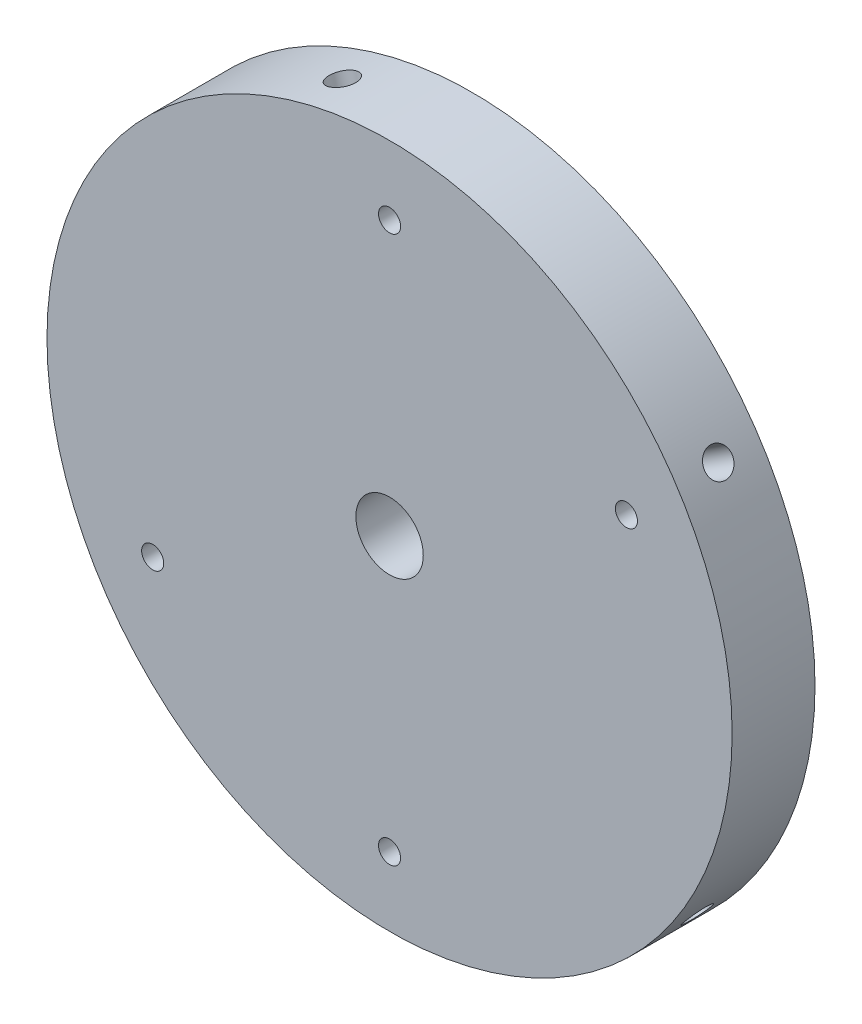
ISO-10303-21;
HEADER;
FILE_DESCRIPTION(('STEP AP214'),'2;1');
FILE_NAME('part.step','',(''),(''),'','','');
FILE_SCHEMA(('AUTOMOTIVE_DESIGN { 1 0 10303 214 1 1 1 1 }'));
ENDSEC;
DATA;
#1=APPLICATION_CONTEXT('core data for automotive mechanical design processes');
#2=APPLICATION_PROTOCOL_DEFINITION('international standard','automotive_design',2000,#1);
#3=PRODUCT_CONTEXT('',#1,'mechanical');
#4=PRODUCT('Part','Part','',(#3));
#5=PRODUCT_RELATED_PRODUCT_CATEGORY('part','',(#4));
#6=PRODUCT_DEFINITION_FORMATION('','',#4);
#7=PRODUCT_DEFINITION_CONTEXT('part definition',#1,'design');
#8=PRODUCT_DEFINITION('design','',#6,#7);
#9=PRODUCT_DEFINITION_SHAPE('','',#8);
#10=(LENGTH_UNIT() NAMED_UNIT(*) SI_UNIT(.MILLI.,.METRE.));
#11=(NAMED_UNIT(*) PLANE_ANGLE_UNIT() SI_UNIT($,.RADIAN.));
#12=(NAMED_UNIT(*) SI_UNIT($,.STERADIAN.) SOLID_ANGLE_UNIT());
#13=UNCERTAINTY_MEASURE_WITH_UNIT(LENGTH_MEASURE(1.E-05),#10,'distance_accuracy_value','');
#14=(GEOMETRIC_REPRESENTATION_CONTEXT(3) GLOBAL_UNCERTAINTY_ASSIGNED_CONTEXT((#13)) GLOBAL_UNIT_ASSIGNED_CONTEXT((#10,
#11,#12)) REPRESENTATION_CONTEXT('',''));
#15=CARTESIAN_POINT('',(0.,0.,0.));
#16=DIRECTION('',(0.,0.,1.));
#17=DIRECTION('',(1.,0.,0.));
#18=AXIS2_PLACEMENT_3D('',#15,#16,#17);
#19=CARTESIAN_POINT('',(0.,0.,15.));
#20=DIRECTION('',(0.,0.,-1.));
#21=DIRECTION('',(-1.,0.,0.));
#22=AXIS2_PLACEMENT_3D('',#19,#20,#21);
#23=CYLINDRICAL_SURFACE('',#22,62.);
#24=CARTESIAN_POINT('',(0.,0.,15.));
#25=DIRECTION('',(0.,0.,1.));
#26=DIRECTION('',(1.,0.,0.));
#27=AXIS2_PLACEMENT_3D('',#24,#25,#26);
#28=CIRCLE('',#27,62.);
#29=CARTESIAN_POINT('',(62.,0.,15.));
#30=VERTEX_POINT('',#29);
#31=EDGE_CURVE('E113',#30,#30,#28,.T.);
#32=ORIENTED_EDGE('',*,*,#31,.F.);
#33=EDGE_LOOP('',(#32));
#34=FACE_BOUND('',#33,.T.);
#35=CARTESIAN_POINT('',(0.,0.,0.));
#36=DIRECTION('',(0.,0.,1.));
#37=DIRECTION('',(1.,0.,0.));
#38=AXIS2_PLACEMENT_3D('',#35,#36,#37);
#39=CIRCLE('',#38,62.);
#40=CARTESIAN_POINT('',(62.,0.,0.));
#41=VERTEX_POINT('',#40);
#42=EDGE_CURVE('E114',#41,#41,#39,.T.);
#43=ORIENTED_EDGE('',*,*,#42,.T.);
#44=EDGE_LOOP('',(#43));
#45=FACE_BOUND('',#44,.T.);
#46=CARTESIAN_POINT('',(50.5936887265813,35.8368338590032,7.5));
#47=CARTESIAN_POINT('',(50.5936926758918,35.8368290243256,7.64036484046));
#48=CARTESIAN_POINT('',(50.6005531169775,35.827148948982,7.78083000574222));
#49=CARTESIAN_POINT('',(50.6277909683293,35.7886478690633,8.05788764991403));
#50=CARTESIAN_POINT('',(50.6481844250087,35.7598041416484,8.19447533045048));
#51=CARTESIAN_POINT('',(50.701805445736,35.6837368764997,8.4597243103181));
#52=CARTESIAN_POINT('',(50.7350266114433,35.6365225017822,8.58838952426281));
#53=CARTESIAN_POINT('',(50.8131988457426,35.5249692371488,8.83417390736984));
#54=CARTESIAN_POINT('',(50.8581470938532,35.4606344647867,8.95129584348748));
#55=CARTESIAN_POINT('',(50.9583458604191,35.3164929314793,9.17078749612255));
#56=CARTESIAN_POINT('',(51.0136026736542,35.2366767158206,9.27314813078338));
#57=CARTESIAN_POINT('',(51.1326341849553,35.063723678787,9.46013447703892));
#58=CARTESIAN_POINT('',(51.1964092258855,34.9705863212167,9.54475947441003));
#59=CARTESIAN_POINT('',(51.3304956159422,34.7734728060118,9.69389350495605));
#60=CARTESIAN_POINT('',(51.4008090651043,34.6694931646933,9.75839604593983));
#61=CARTESIAN_POINT('',(51.5457942902115,34.4535627400288,9.86541233223202));
#62=CARTESIAN_POINT('',(51.62046604165,34.3416120015032,9.90792620116873));
#63=CARTESIAN_POINT('',(51.7718880772033,34.1129065475194,9.96973593763066));
#64=CARTESIAN_POINT('',(51.8486371980193,33.9961545024526,9.98904453557293));
#65=CARTESIAN_POINT('',(52.0020170987377,33.7610709582728,10.0039348911709));
#66=CARTESIAN_POINT('',(52.0786478793181,33.642739468247,9.99951678527569));
#67=CARTESIAN_POINT('',(52.2295819501551,33.407936813515,9.9670897791515));
#68=CARTESIAN_POINT('',(52.3038865675879,33.2914646073097,9.93909459480292));
#69=CARTESIAN_POINT('',(52.4481862466918,33.0636651198958,9.86032935522111));
#70=CARTESIAN_POINT('',(52.5181812949693,32.9523378546772,9.80955922920987));
#71=CARTESIAN_POINT('',(52.6520346750383,32.7380394682945,9.68666958744872));
#72=CARTESIAN_POINT('',(52.7158911974024,32.6350708123452,9.614543802187));
#73=CARTESIAN_POINT('',(52.8358152200186,32.4405565175598,9.45099483658834));
#74=CARTESIAN_POINT('',(52.8918826855811,32.349010929598,9.35957157031199));
#75=CARTESIAN_POINT('',(52.9948791220211,32.1800032728446,9.15994522513069));
#76=CARTESIAN_POINT('',(53.0418015590899,32.102551276042,9.05173024755381));
#77=CARTESIAN_POINT('',(53.1253276057696,31.9641380789722,8.82163419086395));
#78=CARTESIAN_POINT('',(53.1619312132752,31.9031768820694,8.69975310896283));
#79=CARTESIAN_POINT('',(53.2239571984162,31.7995918713834,8.44577761632251));
#80=CARTESIAN_POINT('',(53.2493793585697,31.7569684142738,8.31368300698656));
#81=CARTESIAN_POINT('',(53.2884509261385,31.6913626769,8.04303329383485));
#82=CARTESIAN_POINT('',(53.3021003912107,31.6683803004435,7.90447822166275));
#83=CARTESIAN_POINT('',(53.3173073744889,31.6427710686842,7.62494516386062));
#84=CARTESIAN_POINT('',(53.3188734014721,31.6401298897522,7.48396895324145));
#85=CARTESIAN_POINT('',(53.3099000946662,31.655246424322,7.2035035904594));
#86=CARTESIAN_POINT('',(53.2993607866879,31.6730040943299,7.06401443512651));
#87=CARTESIAN_POINT('',(53.2664241047385,31.7283641123697,6.79052935674922));
#88=CARTESIAN_POINT('',(53.2440306267215,31.7659599404425,6.65653164448464));
#89=CARTESIAN_POINT('',(53.1879053439236,31.859844616874,6.39777813070532));
#90=CARTESIAN_POINT('',(53.1541734968503,31.9161335349584,6.2730223636654));
#91=CARTESIAN_POINT('',(53.0761396031092,32.0457346261736,6.03621745685201));
#92=CARTESIAN_POINT('',(53.031831647427,32.1190563151272,5.92417547225561));
#93=CARTESIAN_POINT('',(52.9337153306703,32.2805000004911,5.71605050866476));
#94=CARTESIAN_POINT('',(52.8799069288246,32.3686220604173,5.61996759816223));
#95=CARTESIAN_POINT('',(52.7640770920216,32.5570942635511,5.44643248443826));
#96=CARTESIAN_POINT('',(52.7020509533899,32.65745140724,5.36899102327457));
#97=CARTESIAN_POINT('',(52.5713814396478,32.8673868771493,5.23501050699953));
#98=CARTESIAN_POINT('',(52.5027380857774,32.9769651737713,5.17847138479849));
#99=CARTESIAN_POINT('',(52.3606547398298,33.2021013436181,5.08791931374445));
#100=CARTESIAN_POINT('',(52.2872162286579,33.3176573684513,5.05389944600376));
#101=CARTESIAN_POINT('',(52.1375147665491,33.5514353170301,5.00932891130332));
#102=CARTESIAN_POINT('',(52.0612518241912,33.6696572326782,4.99877817306516));
#103=CARTESIAN_POINT('',(51.9080942458762,33.905301722333,5.00144617427888));
#104=CARTESIAN_POINT('',(51.8312000971995,34.0227248045613,5.01464803200868));
#105=CARTESIAN_POINT('',(51.678947345729,34.2535476211072,5.06441165533015));
#106=CARTESIAN_POINT('',(51.6035887459179,34.36694734761,5.10097346629227));
#107=CARTESIAN_POINT('',(51.4566453722543,34.5865742702737,5.19641607732657));
#108=CARTESIAN_POINT('',(51.3850606489642,34.692801370341,5.2552971763463));
#109=CARTESIAN_POINT('',(51.2478497787219,34.895169552454,5.39370313415374));
#110=CARTESIAN_POINT('',(51.1822234312019,34.9913109740158,5.47322729771691));
#111=CARTESIAN_POINT('',(51.0589347087521,35.17096936402,5.65071921469352));
#112=CARTESIAN_POINT('',(51.0012771615049,35.2544786825123,5.74869806419981));
#113=CARTESIAN_POINT('',(50.8957958765551,35.4065891433488,5.96032340024576));
#114=CARTESIAN_POINT('',(50.8479745702227,35.4751865999437,6.07397374897453));
#115=CARTESIAN_POINT('',(50.763702552755,35.5956729156681,6.31378069352726));
#116=CARTESIAN_POINT('',(50.7272608377677,35.6475485563886,6.43994708062256));
#117=CARTESIAN_POINT('',(50.6670336225876,35.7331004388864,6.70103906227634));
#118=CARTESIAN_POINT('',(50.6432330953463,35.7667982900248,6.83595404191434));
#119=CARTESIAN_POINT('',(50.6153590312695,35.8062250557015,7.05976248379998));
#120=CARTESIAN_POINT('',(50.6072444294056,35.8176897726741,7.14720458830734));
#121=CARTESIAN_POINT('',(50.5964080338224,35.8329956959987,7.3230845082356));
#122=CARTESIAN_POINT('',(50.5936862371701,35.8368369064973,7.41152232311489));
#123=CARTESIAN_POINT('',(50.5936887265813,35.8368338590032,7.5));
#124=B_SPLINE_CURVE_WITH_KNOTS('',3,(#46,#47,#48,#49,#50,#51,#52,#53,#54,#55,#56,#57,#58,#59,
#60,#61,#62,#63,#64,#65,#66,#67,#68,#69,#70,#71,#72,#73,#74,#75,#76,#77,#78,#79,#80,#81,#82,#83,
#84,#85,#86,#87,#88,#89,#90,#91,#92,#93,#94,#95,#96,#97,#98,#99,#100,#101,#102,#103,#104,#105,
#106,#107,#108,#109,#110,#111,#112,#113,#114,#115,#116,#117,#118,#119,#120,#121,#122,#123),
.UNSPECIFIED.,.T.,.F.,(4,2,2,2,2,2,2,2,2,2,2,2,2,2,2,2,2,2,2,2,2,2,2,2,2,2,2,2,2,2,2,2,2,2,2,2,
2,2,4),(0.,0.420771556219567,0.842042924732916,1.26310443791832,1.68406477477344,
2.1052830115298,2.52651820771199,2.94788916852539,3.36925776021234,3.79039508331678,
4.21152998452125,4.63242006111271,5.05331144571949,5.47432651671281,5.89534346269418,
6.31666011690317,6.73797685706884,7.15930179158201,7.5806246626422,8.0016508242873,
8.4226760882315,8.84356306517681,9.26445161205908,9.68557586774526,10.1067019307334,
10.5280700880347,10.9494368928702,11.3706741754579,11.7919101786982,12.2128469144296,
12.6337844677202,13.0547276593044,13.4756566760519,13.8968395938404,14.318126496899,
14.7397456105034,15.1608624017037,15.4260919985229,15.6913214510812),.UNSPECIFIED.);
#125=CARTESIAN_POINT('',(50.5936887265813,35.8368338590032,7.5));
#126=VERTEX_POINT('',#125);
#127=EDGE_CURVE('E106',#126,#126,#124,.T.);
#128=ORIENTED_EDGE('',*,*,#127,.F.);
#129=EDGE_LOOP('',(#128));
#130=FACE_BOUND('',#129,.T.);
#131=CARTESIAN_POINT('',(49.717163989622,-37.0432666597998,7.5));
#132=CARTESIAN_POINT('',(49.7171606119745,-37.0432719098148,7.64036484046));
#133=CARTESIAN_POINT('',(49.7100743061251,-37.052787884802,7.78083000574222));
#134=CARTESIAN_POINT('',(49.681874562142,-37.0905901088166,8.05788764991403));
#135=CARTESIAN_POINT('',(49.6607444719177,-37.1188986406336,8.19447533045048));
#136=CARTESIAN_POINT('',(49.6049700103818,-37.1934013394534,8.4597243103181));
#137=CARTESIAN_POINT('',(49.5703323764204,-37.2395865897447,8.58838952426281));
#138=CARTESIAN_POINT('',(49.4883954660636,-37.3484046571181,8.83417390736984));
#139=CARTESIAN_POINT('',(49.4410992341178,-37.4110335193689,8.95129584348747));
#140=CARTESIAN_POINT('',(49.3349756112813,-37.5508703926234,9.17078749612255));
#141=CARTESIAN_POINT('',(49.2761411736177,-37.6280873119856,9.27314813078338));
#142=CARTESIAN_POINT('',(49.1484358205921,-37.794738434125,9.46013447703892));
#143=CARTESIAN_POINT('',(49.0795645012287,-37.8841731286791,9.54475947441004));
#144=CARTESIAN_POINT('',(48.9335333813851,-38.0726082897084,9.69389350495605));
#145=CARTESIAN_POINT('',(48.8563709166713,-38.1716118299536,9.75839604593983));
#146=CARTESIAN_POINT('',(48.6958117777192,-38.3762271438822,9.86541233223201));
#147=CARTESIAN_POINT('',(48.6124151385347,-38.4818388804082,9.90792620116873));
#148=CARTESIAN_POINT('',(48.4416953085199,-38.6965236660191,9.96973593763066));
#149=CARTESIAN_POINT('',(48.3543742979038,-38.8055947835448,9.98904453557293));
#150=CARTESIAN_POINT('',(48.1781935572554,-39.0241125478412,10.0039348911709));
#151=CARTESIAN_POINT('',(48.089333836075,-39.1335591924486,9.99951678527569));
#152=CARTESIAN_POINT('',(47.9126644341675,-39.3496640346856,9.9670897791515));
#153=CARTESIAN_POINT('',(47.824854173036,-39.4563238163757,9.93909459480291));
#154=CARTESIAN_POINT('',(47.6527950392483,-39.6639548794076,9.86032935522111));
#155=CARTESIAN_POINT('',(47.5685461776607,-39.7649261430701,9.80955922920987));
#156=CARTESIAN_POINT('',(47.4060992700557,-39.9584501156723,9.68666958744872));
#157=CARTESIAN_POINT('',(47.3279030094532,-40.0510003419509,9.614543802187));
#158=CARTESIAN_POINT('',(47.1799674829072,-40.2251630878579,9.45099483658833));
#159=CARTESIAN_POINT('',(47.1102282546284,-40.3067755587735,9.35957157031198));
#160=CARTESIAN_POINT('',(46.9813200705893,-40.4569572289212,9.15994522513068));
#161=CARTESIAN_POINT('',(46.9221586748018,-40.5255171017163,9.0517302475538));
#162=CARTESIAN_POINT('',(46.8163308696843,-40.6477271228317,8.82163419086395));
#163=CARTESIAN_POINT('',(46.7696644629035,-40.7013772681102,8.69975310896283));
#164=CARTESIAN_POINT('',(46.6903163470014,-40.7923770141226,8.44577761632251));
#165=CARTESIAN_POINT('',(46.6576349098915,-40.8297262978008,8.31368300698656));
#166=CARTESIAN_POINT('',(46.6073139242315,-40.887158854516,8.04303329383485));
#167=CARTESIAN_POINT('',(46.589674302014,-40.907242212113,7.90447822166275));
#168=CARTESIAN_POINT('',(46.5700176915381,-40.9296186004795,7.62494516386062));
#169=CARTESIAN_POINT('',(46.5679897100556,-40.9319241498217,7.48396895324145));
#170=CARTESIAN_POINT('',(46.5795934844633,-40.9187187618331,7.2035035904594));
#171=CARTESIAN_POINT('',(46.5932252069642,-40.9032078624902,7.06401443512651));
#172=CARTESIAN_POINT('',(46.6356977184025,-40.8547760301139,6.79052935674922));
#173=CARTESIAN_POINT('',(46.6645335104062,-40.8218608171311,6.65653164448464));
#174=CARTESIAN_POINT('',(46.736479477508,-40.7394705406686,6.39777813070532));
#175=CARTESIAN_POINT('',(46.7795897058501,-40.6899954154199,6.2730223636654));
#176=CARTESIAN_POINT('',(46.8787338688661,-40.5757318326103,6.03621745685201));
#177=CARTESIAN_POINT('',(46.9347750276393,-40.5109348146922,5.92417547225561));
#178=CARTESIAN_POINT('',(47.057997487316,-40.3677318098739,5.71605050866476));
#179=CARTESIAN_POINT('',(47.1251788360277,-40.2893257645705,5.61996759816223));
#180=CARTESIAN_POINT('',(47.2686331649308,-40.120923929762,5.44643248443826));
#181=CARTESIAN_POINT('',(47.3449113494603,-40.0309215035289,5.36899102327457));
#182=CARTESIAN_POINT('',(47.504192745726,-39.8417737830794,5.23501050699953));
#183=CARTESIAN_POINT('',(47.587195935876,-39.7426285182097,5.17847138479849));
#184=CARTESIAN_POINT('',(47.7574069887471,-39.5379283236581,5.08791931374445));
#185=CARTESIAN_POINT('',(47.8446135511681,-39.4323753735851,5.05389944600376));
#186=CARTESIAN_POINT('',(48.0206892966558,-39.2177594635267,5.00932891130332));
#187=CARTESIAN_POINT('',(48.1095584746721,-39.1086965142026,4.99877817306516));
#188=CARTESIAN_POINT('',(48.2863414075707,-38.890216849392,5.00144617427888));
#189=CARTESIAN_POINT('',(48.3742557963783,-38.7808004402875,5.01464803200868));
#190=CARTESIAN_POINT('',(48.5467326525191,-38.5646712958754,5.06441165533016));
#191=CARTESIAN_POINT('',(48.6312951133417,-38.4579585658194,5.10097346629227));
#192=CARTESIAN_POINT('',(48.7947647296221,-38.2503386612449,5.19641607732657));
#193=CARTESIAN_POINT('',(48.873671809314,-38.1494315645087,5.2552971763463));
#194=CARTESIAN_POINT('',(49.0237348968856,-37.9564010648645,5.39370313415374));
#195=CARTESIAN_POINT('',(49.0948911656853,-37.864277366289,5.47322729771691));
#196=CARTESIAN_POINT('',(49.2276581377541,-37.6915053277241,5.65071921469352));
#197=CARTESIAN_POINT('',(49.2892630573243,-37.6108639430982,5.74869806419981));
#198=CARTESIAN_POINT('',(49.4013331926615,-37.4635405622789,5.96032340024576));
#199=CARTESIAN_POINT('',(49.4517956544073,-37.396862017415,6.07397374897453));
#200=CARTESIAN_POINT('',(49.5403434645537,-37.2794822469126,6.31378069352726));
#201=CARTESIAN_POINT('',(49.5784190214626,-37.2287936618322,6.43994708062256));
#202=CARTESIAN_POINT('',(49.641172463779,-37.1450771907842,6.70103906227634));
#203=CARTESIAN_POINT('',(49.6658662572967,-37.1120283355844,6.83595404191433));
#204=CARTESIAN_POINT('',(49.6947497802079,-37.0733349846812,7.05976248379998));
#205=CARTESIAN_POINT('',(49.7031458241136,-37.0620747473212,7.14720458830734));
#206=CARTESIAN_POINT('',(49.7143539918365,-37.0470389322668,7.3230845082356));
#207=CARTESIAN_POINT('',(49.7171661186908,-37.0432633505015,7.41152232311489));
#208=CARTESIAN_POINT('',(49.717163989622,-37.0432666597998,7.5));
#209=B_SPLINE_CURVE_WITH_KNOTS('',3,(#131,#132,#133,#134,#135,#136,#137,#138,#139,#140,#141,
#142,#143,#144,#145,#146,#147,#148,#149,#150,#151,#152,#153,#154,#155,#156,#157,#158,#159,#160,
#161,#162,#163,#164,#165,#166,#167,#168,#169,#170,#171,#172,#173,#174,#175,#176,#177,#178,#179,
#180,#181,#182,#183,#184,#185,#186,#187,#188,#189,#190,#191,#192,#193,#194,#195,#196,#197,#198,
#199,#200,#201,#202,#203,#204,#205,#206,#207,#208),.UNSPECIFIED.,.T.,.F.,(4,2,2,2,2,2,2,2,2,2,2,
2,2,2,2,2,2,2,2,2,2,2,2,2,2,2,2,2,2,2,2,2,2,2,2,2,2,2,4),(0.,0.420771556219569,
0.842042924732916,1.26310443791832,1.68406477477344,2.1052830115298,2.526518207712,
2.94788916852539,3.36925776021233,3.79039508331677,4.21152998452126,4.63242006111271,
5.05331144571949,5.47432651671282,5.89534346269419,6.31666011690318,6.73797685706884,
7.15930179158201,7.5806246626422,8.0016508242873,8.4226760882315,8.84356306517681,
9.26445161205908,9.68557586774526,10.1067019307334,10.5280700880347,10.9494368928702,
11.3706741754579,11.7919101786982,12.2128469144296,12.6337844677202,13.0547276593044,
13.4756566760519,13.8968395938404,14.318126496899,14.7397456105034,15.1608624017037,
15.4260919985229,15.6913214510812),.UNSPECIFIED.);
#210=CARTESIAN_POINT('',(49.717163989622,-37.0432666597998,7.5));
#211=VERTEX_POINT('',#210);
#212=EDGE_CURVE('E63',#211,#211,#209,.T.);
#213=ORIENTED_EDGE('',*,*,#212,.F.);
#214=EDGE_LOOP('',(#213));
#215=FACE_BOUND('',#214,.T.);
#216=CARTESIAN_POINT('',(-19.8667915567424,-58.7308317090857,7.5));
#217=CARTESIAN_POINT('',(-19.8667975935538,-58.7308301190959,7.64036484046));
#218=CARTESIAN_POINT('',(-19.8780376125091,-58.7270312397305,7.78083000574222));
#219=CARTESIAN_POINT('',(-19.9227038641165,-58.7118932191031,8.05788764991403));
#220=CARTESIAN_POINT('',(-19.9561564347398,-58.7005451265228,8.19447533045048));
#221=CARTESIAN_POINT('',(-20.0442479684006,-58.6705230614983,8.4597243103181));
#222=CARTESIAN_POINT('',(-20.0988763691858,-58.6518527412397,8.58838952426281));
#223=CARTESIAN_POINT('',(-20.2276883990189,-58.6075527408332,8.83417390736984));
#224=CARTESIAN_POINT('',(-20.3018673260117,-58.5819247340188,8.95129584348748));
#225=CARTESIAN_POINT('',(-20.4676540984999,-58.5242071412632,9.17078749612255));
#226=CARTESIAN_POINT('',(-20.5592725939201,-58.4921136062769,9.27314813078338));
#227=CARTESIAN_POINT('',(-20.7572303539363,-58.4221566269888,9.46013447703892));
#228=CARTESIAN_POINT('',(-20.8635702110831,-58.3842929504264,9.54475947441003));
#229=CARTESIAN_POINT('',(-21.0879087966184,-58.3036387694131,9.69389350495605));
#230=CARTESIAN_POINT('',(-21.2059112716293,-58.2608466809727,9.75839604593983));
#231=CARTESIAN_POINT('',(-21.4501275018133,-58.1713754749348,9.86541233223202));
#232=CARTESIAN_POINT('',(-21.5763412108154,-58.1246963791933,9.90792620116873));
#233=CARTESIAN_POINT('',(-21.8332739038714,-58.0286734195844,9.96973593763066));
#234=CARTESIAN_POINT('',(-21.9639903771802,-57.9793310323394,9.98904453557293));
#235=CARTESIAN_POINT('',(-22.2262559637824,-57.8792988936405,10.0039348911709));
#236=CARTESIAN_POINT('',(-22.3578050722832,-57.8286091499367,9.99951678527569));
#237=CARTESIAN_POINT('',(-22.617926838271,-57.7273666328405,9.9670897791515));
#238=CARTESIAN_POINT('',(-22.7465011816441,-57.6768137969524,9.93909459480292));
#239=CARTESIAN_POINT('',(-22.9971392535038,-57.5773373636124,9.86032935522111));
#240=CARTESIAN_POINT('',(-23.1192029617559,-57.5284137712243,9.80955922920987));
#241=CARTESIAN_POINT('',(-23.3534540520921,-57.4337197775476,9.68666958744872));
#242=CARTESIAN_POINT('',(-23.4656385213017,-57.387950307105,9.614543802187));
#243=CARTESIAN_POINT('',(-23.6769917274669,-57.3010745088642,9.45099483658834));
#244=CARTESIAN_POINT('',(-23.7761604064549,-57.2599682018341,9.35957157031198));
#245=CARTESIAN_POINT('',(-23.9588264820591,-57.1837779217192,9.15994522513069));
#246=CARTESIAN_POINT('',(-24.0423126725464,-57.1486982565683,9.05173024755381));
#247=CARTESIAN_POINT('',(-24.1912438997436,-57.0858150063137,8.82163419086395));
#248=CARTESIAN_POINT('',(-24.2566889327726,-57.0580114226944,8.69975310896283));
#249=CARTESIAN_POINT('',(-24.3677547504842,-57.0106673480116,8.44577761632252));
#250=CARTESIAN_POINT('',(-24.4133751495729,-56.9911270176706,8.31368300698656));
#251=CARTESIAN_POINT('',(-24.483546796627,-56.9610165524077,8.04303329383485));
#252=CARTESIAN_POINT('',(-24.5080981477783,-56.9504463735543,7.90447822166275));
#253=CARTESIAN_POINT('',(-24.5354535844342,-56.9386665103509,7.62494516386062));
#254=CARTESIAN_POINT('',(-24.5382729729022,-56.9374502392752,7.48396895324145));
#255=CARTESIAN_POINT('',(-24.5221281391146,-56.9444053952334,7.2035035904594));
#256=CARTESIAN_POINT('',(-24.5031639633055,-56.9525768022513,7.06401443512651));
#257=CARTESIAN_POINT('',(-24.4439778256996,-56.9780043017451,6.79052935674922));
#258=CARTESIAN_POINT('',(-24.4037628481318,-56.9952574094476,6.65653164448464));
#259=CARTESIAN_POINT('',(-24.3031725123115,-57.0382220946827,6.39777813070532));
#260=CARTESIAN_POINT('',(-24.2427970788601,-57.0639337037658,6.2730223636654));
#261=CARTESIAN_POINT('',(-24.1034887225889,-57.1229160171284,6.03621745685201));
#262=CARTESIAN_POINT('',(-24.0245454260159,-57.1561909466389,5.92417547225561));
#263=CARTESIAN_POINT('',(-23.8502734410016,-57.229130307734,5.71605050866476));
#264=CARTESIAN_POINT('',(-23.754944682242,-57.2687947667393,5.61996759816223));
#265=CARTESIAN_POINT('',(-23.5504551943436,-57.3531889121935,5.44643248443826));
#266=CARTESIAN_POINT('',(-23.4412865450726,-57.3979214974005,5.36899102327457));
#267=CARTESIAN_POINT('',(-23.2121757146628,-57.4909572471774,5.23501050699953));
#268=CARTESIAN_POINT('',(-23.0922335681049,-57.5392604002863,5.17847138479849));
#269=CARTESIAN_POINT('',(-22.8449540062221,-57.6378848923965,5.08791931374445));
#270=CARTESIAN_POINT('',(-22.717618875432,-57.6882056064717,5.05389944600376));
#271=CARTESIAN_POINT('',(-22.4590966180174,-57.789343628108,5.00932891130332));
#272=CARTESIAN_POINT('',(-22.3279095030931,-57.8401609341604,4.99877817306516));
#273=CARTESIAN_POINT('',(-22.0654940636159,-57.9407775651116,5.00144617427888));
#274=CARTESIAN_POINT('',(-21.9342658345559,-57.9905775875864,5.01464803200868));
#275=CARTESIAN_POINT('',(-21.6754165237176,-58.0878252469262,5.06441165533015));
#276=CARTESIAN_POINT('',(-21.5477954489458,-58.1352728792221,5.10097346629227));
#277=CARTESIAN_POINT('',(-21.299822296293,-58.2265836441177,5.19641607732656));
#278=CARTESIAN_POINT('',(-21.1794703158003,-58.270446728696,5.2552971763463));
#279=CARTESIAN_POINT('',(-20.9495153569821,-58.3535155011636,5.39370313415373));
#280=CARTESIAN_POINT('',(-20.8399120168312,-58.3927213458363,5.4732272977169));
#281=CARTESIAN_POINT('',(-20.6345687930594,-58.4656007437017,5.65071921469351));
#282=CARTESIAN_POINT('',(-20.5388373116437,-58.4992709455954,5.7486980641998));
#283=CARTESIAN_POINT('',(-20.3640928739317,-58.560330549748,5.96032340024576));
#284=CARTESIAN_POINT('',(-20.2850840510844,-58.5877183992966,6.07397374897453));
#285=CARTESIAN_POINT('',(-20.1460864773169,-58.6356600272589,6.31378069352727));
#286=CARTESIAN_POINT('',(-20.0861127740192,-58.6562083995581,6.43994708062256));
#287=CARTESIAN_POINT('',(-19.9871017985765,-58.69002065753,6.70103906227634));
#288=CARTESIAN_POINT('',(-19.9480396676302,-58.7032931928657,6.83595404191433));
#289=CARTESIAN_POINT('',(-19.9023146046794,-58.7188061525456,7.05976248379998));
#290=CARTESIAN_POINT('',(-19.8890109623107,-58.7233116601082,7.14720458830734));
#291=CARTESIAN_POINT('',(-19.8712475381232,-58.7293249386807,7.3230845082356));
#292=CARTESIAN_POINT('',(-19.8667877514942,-58.7308327113211,7.41152232311489));
#293=CARTESIAN_POINT('',(-19.8667915567424,-58.7308317090857,7.5));
#294=B_SPLINE_CURVE_WITH_KNOTS('',3,(#216,#217,#218,#219,#220,#221,#222,#223,#224,#225,#226,
#227,#228,#229,#230,#231,#232,#233,#234,#235,#236,#237,#238,#239,#240,#241,#242,#243,#244,#245,
#246,#247,#248,#249,#250,#251,#252,#253,#254,#255,#256,#257,#258,#259,#260,#261,#262,#263,#264,
#265,#266,#267,#268,#269,#270,#271,#272,#273,#274,#275,#276,#277,#278,#279,#280,#281,#282,#283,
#284,#285,#286,#287,#288,#289,#290,#291,#292,#293),.UNSPECIFIED.,.T.,.F.,(4,2,2,2,2,2,2,2,2,2,2,
2,2,2,2,2,2,2,2,2,2,2,2,2,2,2,2,2,2,2,2,2,2,2,2,2,2,2,4),(0.,0.42077155621957,0.842042924732915,
1.26310443791831,1.68406477477344,2.1052830115298,2.526518207712,2.9478891685254,
3.36925776021233,3.79039508331677,4.21152998452125,4.63242006111271,5.05331144571949,
5.47432651671281,5.89534346269418,6.31666011690317,6.73797685706884,7.15930179158201,
7.5806246626422,8.0016508242873,8.4226760882315,8.84356306517681,9.26445161205908,
9.68557586774526,10.1067019307334,10.5280700880347,10.9494368928702,11.3706741754579,
11.7919101786982,12.2128469144296,12.6337844677202,13.0547276593044,13.4756566760519,
13.8968395938404,14.318126496899,14.7397456105034,15.1608624017037,15.4260919985229,
15.6913214510812),.UNSPECIFIED.);
#295=CARTESIAN_POINT('',(-19.8667915567424,-58.7308317090857,7.5));
#296=VERTEX_POINT('',#295);
#297=EDGE_CURVE('E58',#296,#296,#294,.T.);
#298=ORIENTED_EDGE('',*,*,#297,.F.);
#299=EDGE_LOOP('',(#298));
#300=FACE_BOUND('',#299,.T.);
#301=CARTESIAN_POINT('',(-61.9955164190981,0.745616476035041,7.5));
#302=CARTESIAN_POINT('',(-61.9955167724053,0.745622708717774,7.64036484046));
#303=CARTESIAN_POINT('',(-61.9953771803045,0.757486520271986,7.78083000574222));
#304=CARTESIAN_POINT('',(-61.9947826979647,0.804644555556691,8.05788764991403));
#305=CARTESIAN_POINT('',(-61.9943274333968,0.839966594295895,8.19447533045048));
#306=CARTESIAN_POINT('',(-61.9929965337843,0.933023949713212,8.4597243103181));
#307=CARTESIAN_POINT('',(-61.9921211082593,0.99074809250515,8.58838952426281));
#308=CARTESIAN_POINT('',(-61.9897944104991,1.12694506583148,8.83417390736984));
#309=CARTESIAN_POINT('',(-61.9883432766839,1.20541290735743,8.95129584348748));
#310=CARTESIAN_POINT('',(-61.9846815141303,1.38092121468373,9.17078749612255));
#311=CARTESIAN_POINT('',(-61.9824704206345,1.47797302948663,9.27314813078338));
#312=CARTESIAN_POINT('',(-61.9771096916356,1.68785994257635,9.46013447703892));
#313=CARTESIAN_POINT('',(-61.9739600183478,1.80069567618504,9.54475947441003));
#314=CARTESIAN_POINT('',(-61.9665777693531,2.03897786241531,9.69389350495605));
#315=CARTESIAN_POINT('',(-61.9623448449526,2.16442836776626,9.75839604593983));
#316=CARTESIAN_POINT('',(-61.9527196368586,2.42433992804074,9.86541233223202));
#317=CARTESIAN_POINT('',(-61.9473273596835,2.55880093229916,9.90792620116873));
#318=CARTESIAN_POINT('',(-61.9354006667985,2.83283117064864,9.96973593763066));
#319=CARTESIAN_POINT('',(-61.9288668795767,2.97239756057784,9.98904453557293));
#320=CARTESIAN_POINT('',(-61.9147751855279,3.25273858655752,10.0039348911709));
#321=CARTESIAN_POINT('',(-61.9072172845907,3.39351321565493,9.99951678527569));
#322=CARTESIAN_POINT('',(-61.8913119752774,3.6721893745639,9.9670897791515));
#323=CARTESIAN_POINT('',(-61.8829650284316,3.81009252706051,9.93909459480292));
#324=CARTESIAN_POINT('',(-61.8658087419279,4.07920340697618,9.86032935522111));
#325=CARTESIAN_POINT('',(-61.8569994008329,4.21041111358629,9.80955922920987));
#326=CARTESIAN_POINT('',(-61.8393276289574,4.46245919281111,9.68666958744872));
#327=CARTESIAN_POINT('',(-61.8304651833363,4.58329650747028,9.614543802187));
#328=CARTESIAN_POINT('',(-61.8131531218317,4.81115144948993,9.45099483658833));
#329=CARTESIAN_POINT('',(-61.8047035077869,4.91816901530211,9.35957157031198));
#330=CARTESIAN_POINT('',(-61.7886891670627,5.11543886817323,9.15994522513069));
#331=CARTESIAN_POINT('',(-61.7811250745877,5.2056791663455,9.0517302475538));
#332=CARTESIAN_POINT('',(-61.7673418298643,5.36675317344138,8.82163419086395));
#333=CARTESIAN_POINT('',(-61.7611226778902,5.43758687840565,8.69975310896283));
#334=CARTESIAN_POINT('',(-61.7504170123223,5.55784687173791,8.44577761632252));
#335=CARTESIAN_POINT('',(-61.7459305324295,5.60727274371822,8.31368300698656));
#336=CARTESIAN_POINT('',(-61.7389780096955,5.683314591383,8.04303329383485));
#337=CARTESIAN_POINT('',(-61.7365119569592,5.70993067877853,7.90447822166275));
#338=CARTESIAN_POINT('',(-61.7337619361138,5.73958742298754,7.62494516386062));
#339=CARTESIAN_POINT('',(-61.7334764325319,5.74264466919411,7.48396895324145));
#340=CARTESIAN_POINT('',(-61.7351021509161,5.72514075842628,7.2035035904594));
#341=CARTESIAN_POINT('',(-61.7370133681984,5.7045796518104,7.06401443512651));
#342=CARTESIAN_POINT('',(-61.7429068349335,5.64043276049798,6.79052935674922));
#343=CARTESIAN_POINT('',(-61.7468884039435,5.59685454054352,6.65653164448464));
#344=CARTESIAN_POINT('',(-61.7566661245685,5.48791062828972,6.39777813070532));
#345=CARTESIAN_POINT('',(-61.7624622829521,5.42254485472224,6.2730223636654));
#346=CARTESIAN_POINT('',(-61.7755091468756,5.2718281975195,6.03621745685201));
#347=CARTESIAN_POINT('',(-61.7827606651828,5.18646614219061,5.92417547225561));
#348=CARTESIAN_POINT('',(-61.7982771148338,4.99818413309786,5.71605050866476));
#349=CARTESIAN_POINT('',(-61.8065420505267,4.89526410398389,5.61996759816223));
#350=CARTESIAN_POINT('',(-61.8236149255665,4.67470381883313,5.44643248443826));
#351=CARTESIAN_POINT('',(-61.8324231743406,4.55705513453749,5.36899102327457));
#352=CARTESIAN_POINT('',(-61.8501062902223,4.31040815855697,5.23501050699953));
#353=CARTESIAN_POINT('',(-61.858981157116,4.18140990330214,5.17847138479849));
#354=CARTESIAN_POINT('',(-61.8763650360203,3.91575642050325,5.08791931374445));
#355=CARTESIAN_POINT('',(-61.8848741596511,3.77910355879366,5.05389944600376));
#356=CARTESIAN_POINT('',(-61.9011743632082,3.5019809138091,5.00932891130332));
#357=CARTESIAN_POINT('',(-61.9089654453153,3.36151114212785,4.99877817306516));
#358=CARTESIAN_POINT('',(-61.9235667174442,3.08084697955596,5.00144617427888));
#359=CARTESIAN_POINT('',(-61.9303776004092,2.94065246392157,5.01464803200868));
#360=CARTESIAN_POINT('',(-61.9428767844875,2.66442096071115,5.06441165533015));
#361=CARTESIAN_POINT('',(-61.9485650834204,2.52838398121055,5.10097346629227));
#362=CARTESIAN_POINT('',(-61.9587788630639,2.26433092039176,5.19641607732656));
#363=CARTESIAN_POINT('',(-61.9633043281979,2.13631494653477,5.2552971763463));
#364=CARTESIAN_POINT('',(-61.9712474353383,1.89194512210192,5.39370313415373));
#365=CARTESIAN_POINT('',(-61.9746651146442,1.77559087896101,5.4732272977169));
#366=CARTESIAN_POINT('',(-61.9805229950626,1.5577768954356,5.65071921469351));
#367=CARTESIAN_POINT('',(-61.9829626053244,1.45632618163133,5.7486980641998));
#368=CARTESIAN_POINT('',(-61.9870347388107,1.27126589010609,5.96032340024576));
#369=CARTESIAN_POINT('',(-61.9886670626258,1.18766072334243,6.07397374897453));
#370=CARTESIAN_POINT('',(-61.9913096478301,1.0406513972833,6.31378069352726));
#371=CARTESIAN_POINT('',(-61.9923194176699,0.977263219708554,6.43994708062256));
#372=CARTESIAN_POINT('',(-61.9938807119034,0.872649623997495,6.70103906227634));
#373=CARTESIAN_POINT('',(-61.9944327808232,0.83139789084341,6.83595404191433));
#374=CARTESIAN_POINT('',(-61.9950566606931,0.78311700359195,7.05976248379998));
#375=CARTESIAN_POINT('',(-61.9952306014408,0.769072209421592,7.14720458830734));
#376=CARTESIAN_POINT('',(-61.9954603692592,0.750319983825563,7.3230845082356));
#377=CARTESIAN_POINT('',(-61.9955161963942,0.745612547321217,7.41152232311489));
#378=CARTESIAN_POINT('',(-61.9955164190981,0.745616476035041,7.5));
#379=B_SPLINE_CURVE_WITH_KNOTS('',3,(#301,#302,#303,#304,#305,#306,#307,#308,#309,#310,#311,
#312,#313,#314,#315,#316,#317,#318,#319,#320,#321,#322,#323,#324,#325,#326,#327,#328,#329,#330,
#331,#332,#333,#334,#335,#336,#337,#338,#339,#340,#341,#342,#343,#344,#345,#346,#347,#348,#349,
#350,#351,#352,#353,#354,#355,#356,#357,#358,#359,#360,#361,#362,#363,#364,#365,#366,#367,#368,
#369,#370,#371,#372,#373,#374,#375,#376,#377,#378),.UNSPECIFIED.,.T.,.F.,(4,2,2,2,2,2,2,2,2,2,2,
2,2,2,2,2,2,2,2,2,2,2,2,2,2,2,2,2,2,2,2,2,2,2,2,2,2,2,4),(0.,0.42077155621957,0.842042924732916,
1.26310443791832,1.68406477477344,2.1052830115298,2.526518207712,2.94788916852539,
3.36925776021234,3.79039508331677,4.21152998452125,4.63242006111271,5.05331144571949,
5.47432651671282,5.89534346269419,6.31666011690317,6.73797685706884,7.15930179158201,
7.5806246626422,8.0016508242873,8.4226760882315,8.84356306517681,9.26445161205908,
9.68557586774526,10.1067019307334,10.5280700880347,10.9494368928702,11.3706741754579,
11.7919101786982,12.2128469144296,12.6337844677202,13.0547276593044,13.4756566760519,
13.8968395938404,14.318126496899,14.7397456105034,15.1608624017037,15.4260919985229,
15.6913214510812),.UNSPECIFIED.);
#380=CARTESIAN_POINT('',(-61.9955164190981,0.745616476035041,7.5));
#381=VERTEX_POINT('',#380);
#382=EDGE_CURVE('E53',#381,#381,#379,.T.);
#383=ORIENTED_EDGE('',*,*,#382,.F.);
#384=EDGE_LOOP('',(#383));
#385=FACE_BOUND('',#384,.T.);
#386=CARTESIAN_POINT('',(-18.4485447403621,59.1916480338473,7.5));
#387=CARTESIAN_POINT('',(-18.4485389219065,59.1916502958673,7.64036484046));
#388=CARTESIAN_POINT('',(-18.4372126302883,59.1951836552784,7.78083000574222));
#389=CARTESIAN_POINT('',(-18.3921789683893,59.2091909032997,8.05788764991403));
#390=CARTESIAN_POINT('',(-18.3584450287891,59.2196730312121,8.19447533045048));
#391=CARTESIAN_POINT('',(-18.2695309539322,59.2471635747387,8.45972431031811));
#392=CARTESIAN_POINT('',(-18.2143615104178,59.264168736697,8.58838952426281));
#393=CARTESIAN_POINT('',(-18.0841115022875,59.304043094971,8.83417390736984));
#394=CARTESIAN_POINT('',(-18.0090357252746,59.3269108812435,8.95129584348748));
#395=CARTESIAN_POINT('',(-17.8409858590695,59.3776633877235,9.17078749612255));
#396=CARTESIAN_POINT('',(-17.7480008327166,59.4055511729553,9.27314813078338));
#397=CARTESIAN_POINT('',(-17.5467299599747,59.4653114397504,9.46013447703892));
#398=CARTESIAN_POINT('',(-17.4384434976825,59.4971840817037,9.54475947441003));
#399=CARTESIAN_POINT('',(-17.2095424313551,59.5637963906944,9.69389350495605));
#400=CARTESIAN_POINT('',(-17.0889238651929,59.5985369784667,9.75839604593983));
#401=CARTESIAN_POINT('',(-16.838758929258,59.6696999507475,9.86541233223202));
#402=CARTESIAN_POINT('',(-16.709212609685,59.706122325799,9.90792620116873));
#403=CARTESIAN_POINT('',(-16.4449088150526,59.7794593674354,9.96973593763066));
#404=CARTESIAN_POINT('',(-16.3101542391655,59.8163737528538,9.98904453557293));
#405=CARTESIAN_POINT('',(-16.039179506682,59.8896018966513,10.0039348911709));
#406=CARTESIAN_POINT('',(-15.9029593585185,59.9259156584833,9.99951678527569));
#407=CARTESIAN_POINT('',(-15.6330075707734,59.9969044794472,9.9670897791515));
#408=CARTESIAN_POINT('',(-15.4992745305474,60.0315804789578,9.93909459480291));
#409=CARTESIAN_POINT('',(-15.2380332905076,60.0984237161481,9.86032935522111));
#410=CARTESIAN_POINT('',(-15.1105251100404,60.1305909460309,9.80955922920987));
#411=CARTESIAN_POINT('',(-14.8653522640437,60.1916712321143,9.68666958744872));
#412=CARTESIAN_POINT('',(-14.7476905022168,60.2205833292403,9.614543802187));
#413=CARTESIAN_POINT('',(-14.5256378536264,60.2745296296722,9.45099483658833));
#414=CARTESIAN_POINT('',(-14.4212470259669,60.2995638157073,9.35957157031198));
#415=CARTESIAN_POINT('',(-14.2286835434878,60.3452930096225,9.15994522513069));
#416=CARTESIAN_POINT('',(-14.1405224867568,60.365984915897,9.0517302475538));
#417=CARTESIAN_POINT('',(-13.9830727458453,60.4026508767317,8.82163419086395));
#418=CARTESIAN_POINT('',(-13.9137840655152,60.4186249303295,8.69975310896283));
#419=CARTESIAN_POINT('',(-13.7961017826103,60.4456056190129,8.44577761632252));
#420=CARTESIAN_POINT('',(-13.7477085864581,60.4566121574793,8.31368300698656));
#421=CARTESIAN_POINT('',(-13.6732400440468,60.4734981386406,8.04303329383485));
#422=CARTESIAN_POINT('',(-13.6471645884864,60.4793776064452,7.90447822166275));
#423=CARTESIAN_POINT('',(-13.6181095454782,60.4859266191586,7.62494516386062));
#424=CARTESIAN_POINT('',(-13.6151137060928,60.4865998301505,7.48396895324145));
#425=CARTESIAN_POINT('',(-13.632263289098,60.4827369743182,7.2035035904594));
#426=CARTESIAN_POINT('',(-13.6524086621474,60.4782009186011,7.06401443512651));
#427=CARTESIAN_POINT('',(-13.7152371625071,60.4639834589912,6.79052935674922));
#428=CARTESIAN_POINT('',(-13.7579128850517,60.4543037455926,6.65653164448464));
#429=CARTESIAN_POINT('',(-13.8645461845508,60.4299373901875,6.39777813070532));
#430=CARTESIAN_POINT('',(-13.9285038408874,60.4152507295049,6.2730223636654));
#431=CARTESIAN_POINT('',(-14.07587560251,60.3810850260456,6.03621745685201));
#432=CARTESIAN_POINT('',(-14.1593005838668,60.3616033040132,5.92417547225561));
#433=CARTESIAN_POINT('',(-14.3431622621501,60.3181779840189,5.71605050866476));
#434=CARTESIAN_POINT('',(-14.4435990320828,60.2942343669086,5.61996759816223));
#435=CARTESIAN_POINT('',(-14.6586401370415,60.2423147595713,5.44643248443826));
#436=CARTESIAN_POINT('',(-14.7732525834362,60.2143364591519,5.36899102327457));
#437=CARTESIAN_POINT('',(-15.013292180488,60.1549359945504,5.23501050699952));
#438=CARTESIAN_POINT('',(-15.1387192964317,60.1235138414224,5.17847138479849));
#439=CARTESIAN_POINT('',(-15.3967426863337,60.0579554519331,5.08791931374445));
#440=CARTESIAN_POINT('',(-15.5293367447421,60.0238200528118,5.05389944600376));
#441=CARTESIAN_POINT('',(-15.7979330819786,59.9536868607954,5.00932891130332));
#442=CARTESIAN_POINT('',(-15.9339353504542,59.9176890735569,4.99877817306516));
#443=CARTESIAN_POINT('',(-16.205374872386,59.8448457126146,5.00144617427888));
#444=CARTESIAN_POINT('',(-16.3408124586119,59.808000759391,5.01464803200868));
#445=CARTESIAN_POINT('',(-16.6073866900422,59.7345279609833,5.06441165533016));
#446=CARTESIAN_POINT('',(-16.7385233268927,59.6979001162209,5.10097346629227));
#447=CARTESIAN_POINT('',(-16.9928089425187,59.6260171146971,5.19641607732657));
#448=CARTESIAN_POINT('',(-17.1159578142791,59.5907619763289,5.2552971763463));
#449=CARTESIAN_POINT('',(-17.3508218832864,59.5228018914721,5.39370313415373));
#450=CARTESIAN_POINT('',(-17.462537465411,59.4900968591485,5.4732272977169));
#451=CARTESIAN_POINT('',(-17.6715010583833,59.4283598119702,5.65071921469351));
#452=CARTESIAN_POINT('',(-17.7687403018602,59.39933002455,5.7486980641998));
#453=CARTESIAN_POINT('',(-17.9460014564734,59.346016078572,5.96032340024576));
#454=CARTESIAN_POINT('',(-18.0260191109191,59.3217330934255,6.07397374897453));
#455=CARTESIAN_POINT('',(-18.166649892161,59.27881796122,6.31378069352726));
#456=CARTESIAN_POINT('',(-18.2272476675405,59.2601902852931,6.43994708062256));
#457=CARTESIAN_POINT('',(-18.3272235758859,59.2293477854303,6.70103906227634));
#458=CARTESIAN_POINT('',(-18.3666269041889,59.2171253475819,6.83595404191433));
#459=CARTESIAN_POINT('',(-18.4127375461041,59.2027990779334,7.05976248379998));
#460=CARTESIAN_POINT('',(-18.4261486897669,59.1986244253337,7.14720458830734));
#461=CARTESIAN_POINT('',(-18.4440541182757,59.1930481911232,7.3230845082356));
#462=CARTESIAN_POINT('',(-18.4485484079717,59.191646608004,7.41152232311489));
#463=CARTESIAN_POINT('',(-18.4485447403621,59.1916480338473,7.5));
#464=B_SPLINE_CURVE_WITH_KNOTS('',3,(#386,#387,#388,#389,#390,#391,#392,#393,#394,#395,#396,
#397,#398,#399,#400,#401,#402,#403,#404,#405,#406,#407,#408,#409,#410,#411,#412,#413,#414,#415,
#416,#417,#418,#419,#420,#421,#422,#423,#424,#425,#426,#427,#428,#429,#430,#431,#432,#433,#434,
#435,#436,#437,#438,#439,#440,#441,#442,#443,#444,#445,#446,#447,#448,#449,#450,#451,#452,#453,
#454,#455,#456,#457,#458,#459,#460,#461,#462,#463),.UNSPECIFIED.,.T.,.F.,(4,2,2,2,2,2,2,2,2,2,2,
2,2,2,2,2,2,2,2,2,2,2,2,2,2,2,2,2,2,2,2,2,2,2,2,2,2,2,4),(0.,0.420771556219568,
0.842042924732916,1.26310443791832,1.68406477477344,2.1052830115298,2.526518207712,
2.94788916852539,3.36925776021234,3.79039508331678,4.21152998452125,4.63242006111271,
5.05331144571949,5.47432651671281,5.89534346269419,6.31666011690317,6.73797685706884,
7.15930179158201,7.5806246626422,8.0016508242873,8.4226760882315,8.84356306517681,
9.26445161205908,9.68557586774526,10.1067019307334,10.5280700880347,10.9494368928702,
11.3706741754579,11.7919101786982,12.2128469144296,12.6337844677202,13.0547276593044,
13.4756566760519,13.8968395938404,14.318126496899,14.7397456105034,15.1608624017037,
15.4260919985229,15.6913214510812),.UNSPECIFIED.);
#465=CARTESIAN_POINT('',(-18.4485447403621,59.1916480338473,7.5));
#466=VERTEX_POINT('',#465);
#467=EDGE_CURVE('E10',#466,#466,#464,.T.);
#468=ORIENTED_EDGE('',*,*,#467,.F.);
#469=EDGE_LOOP('',(#468));
#470=FACE_BOUND('',#469,.T.);
#471=ADVANCED_FACE('F41',(#34,#45,#130,#215,#300,#385,#470),#23,.T.);
#472=CARTESIAN_POINT('',(0.,0.,15.));
#473=DIRECTION('',(0.,0.,1.));
#474=DIRECTION('',(1.,0.,0.));
#475=AXIS2_PLACEMENT_3D('',#472,#473,#474);
#476=PLANE('',#475);
#477=CARTESIAN_POINT('',(0.,0.,15.));
#478=DIRECTION('',(0.,0.,1.));
#479=DIRECTION('',(1.,0.,0.));
#480=AXIS2_PLACEMENT_3D('',#477,#478,#479);
#481=CIRCLE('',#480,6.1);
#482=CARTESIAN_POINT('',(6.1,0.,15.));
#483=VERTEX_POINT('',#482);
#484=EDGE_CURVE('E210',#483,#483,#481,.T.);
#485=ORIENTED_EDGE('',*,*,#484,.F.);
#486=EDGE_LOOP('',(#485));
#487=FACE_BOUND('',#486,.T.);
#488=CARTESIAN_POINT('',(-42.8682574873298,-24.7499999999999,15.));
#489=DIRECTION('',(0.,0.,1.));
#490=DIRECTION('',(-0.499999999999998,0.86602540378444,0.));
#491=AXIS2_PLACEMENT_3D('',#488,#489,#490);
#492=CIRCLE('',#491,2.);
#493=CARTESIAN_POINT('',(-43.8682574873298,-23.017949192431,15.));
#494=VERTEX_POINT('',#493);
#495=EDGE_CURVE('E202',#494,#494,#492,.T.);
#496=ORIENTED_EDGE('',*,*,#495,.F.);
#497=EDGE_LOOP('',(#496));
#498=FACE_BOUND('',#497,.T.);
#499=CARTESIAN_POINT('',(0.,-49.5,15.));
#500=DIRECTION('',(0.,0.,1.));
#501=DIRECTION('',(-1.,0.,0.));
#502=AXIS2_PLACEMENT_3D('',#499,#500,#501);
#503=CIRCLE('',#502,2.);
#504=CARTESIAN_POINT('',(-2.,-49.5,15.));
#505=VERTEX_POINT('',#504);
#506=EDGE_CURVE('E194',#505,#505,#503,.T.);
#507=ORIENTED_EDGE('',*,*,#506,.F.);
#508=EDGE_LOOP('',(#507));
#509=FACE_BOUND('',#508,.T.);
#510=CARTESIAN_POINT('',(42.8682574873298,24.7499999999999,15.));
#511=DIRECTION('',(0.,0.,1.));
#512=DIRECTION('',(0.499999999999998,-0.86602540378444,0.));
#513=AXIS2_PLACEMENT_3D('',#510,#511,#512);
#514=CIRCLE('',#513,2.);
#515=CARTESIAN_POINT('',(43.8682574873298,23.017949192431,15.));
#516=VERTEX_POINT('',#515);
#517=EDGE_CURVE('E186',#516,#516,#514,.T.);
#518=ORIENTED_EDGE('',*,*,#517,.F.);
#519=EDGE_LOOP('',(#518));
#520=FACE_BOUND('',#519,.T.);
#521=CARTESIAN_POINT('',(0.,49.5,15.));
#522=DIRECTION('',(0.,0.,1.));
#523=DIRECTION('',(1.,0.,0.));
#524=AXIS2_PLACEMENT_3D('',#521,#522,#523);
#525=CIRCLE('',#524,2.);
#526=CARTESIAN_POINT('',(2.,49.5,15.));
#527=VERTEX_POINT('',#526);
#528=EDGE_CURVE('E177',#527,#527,#525,.T.);
#529=ORIENTED_EDGE('',*,*,#528,.F.);
#530=EDGE_LOOP('',(#529));
#531=FACE_BOUND('',#530,.T.);
#532=ORIENTED_EDGE('',*,*,#31,.T.);
#533=EDGE_LOOP('',(#532));
#534=FACE_BOUND('',#533,.T.);
#535=ADVANCED_FACE('F142',(#487,#498,#509,#520,#531,#534),#476,.T.);
#536=CARTESIAN_POINT('',(0.,0.,0.));
#537=DIRECTION('',(0.,0.,1.));
#538=DIRECTION('',(1.,0.,0.));
#539=AXIS2_PLACEMENT_3D('',#536,#537,#538);
#540=PLANE('',#539);
#541=CARTESIAN_POINT('',(0.,0.,0.));
#542=DIRECTION('',(0.,0.,1.));
#543=DIRECTION('',(1.,0.,0.));
#544=AXIS2_PLACEMENT_3D('',#541,#542,#543);
#545=CIRCLE('',#544,6.1);
#546=CARTESIAN_POINT('',(6.1,0.,0.));
#547=VERTEX_POINT('',#546);
#548=EDGE_CURVE('E206',#547,#547,#545,.T.);
#549=ORIENTED_EDGE('',*,*,#548,.T.);
#550=EDGE_LOOP('',(#549));
#551=FACE_BOUND('',#550,.T.);
#552=CARTESIAN_POINT('',(-42.8682574873298,-24.7499999999999,0.));
#553=DIRECTION('',(0.,0.,1.));
#554=DIRECTION('',(-0.499999999999998,0.86602540378444,0.));
#555=AXIS2_PLACEMENT_3D('',#552,#553,#554);
#556=CIRCLE('',#555,2.);
#557=CARTESIAN_POINT('',(-43.8682574873298,-23.017949192431,0.));
#558=VERTEX_POINT('',#557);
#559=EDGE_CURVE('E198',#558,#558,#556,.T.);
#560=ORIENTED_EDGE('',*,*,#559,.T.);
#561=EDGE_LOOP('',(#560));
#562=FACE_BOUND('',#561,.T.);
#563=CARTESIAN_POINT('',(0.,-49.5,0.));
#564=DIRECTION('',(0.,0.,1.));
#565=DIRECTION('',(-1.,0.,0.));
#566=AXIS2_PLACEMENT_3D('',#563,#564,#565);
#567=CIRCLE('',#566,2.);
#568=CARTESIAN_POINT('',(-2.,-49.5,0.));
#569=VERTEX_POINT('',#568);
#570=EDGE_CURVE('E190',#569,#569,#567,.T.);
#571=ORIENTED_EDGE('',*,*,#570,.T.);
#572=EDGE_LOOP('',(#571));
#573=FACE_BOUND('',#572,.T.);
#574=CARTESIAN_POINT('',(42.8682574873298,24.7499999999999,0.));
#575=DIRECTION('',(0.,0.,1.));
#576=DIRECTION('',(0.499999999999998,-0.86602540378444,0.));
#577=AXIS2_PLACEMENT_3D('',#574,#575,#576);
#578=CIRCLE('',#577,2.);
#579=CARTESIAN_POINT('',(43.8682574873298,23.017949192431,0.));
#580=VERTEX_POINT('',#579);
#581=EDGE_CURVE('E183',#580,#580,#578,.T.);
#582=ORIENTED_EDGE('',*,*,#581,.T.);
#583=EDGE_LOOP('',(#582));
#584=FACE_BOUND('',#583,.T.);
#585=CARTESIAN_POINT('',(0.,49.5,0.));
#586=DIRECTION('',(0.,0.,1.));
#587=DIRECTION('',(1.,0.,0.));
#588=AXIS2_PLACEMENT_3D('',#585,#586,#587);
#589=CIRCLE('',#588,2.);
#590=CARTESIAN_POINT('',(2.,49.5,0.));
#591=VERTEX_POINT('',#590);
#592=EDGE_CURVE('E173',#591,#591,#589,.T.);
#593=ORIENTED_EDGE('',*,*,#592,.T.);
#594=EDGE_LOOP('',(#593));
#595=FACE_BOUND('',#594,.T.);
#596=ORIENTED_EDGE('',*,*,#42,.F.);
#597=EDGE_LOOP('',(#596));
#598=FACE_BOUND('',#597,.T.);
#599=ADVANCED_FACE('F140',(#551,#562,#573,#584,#595,#598),#540,.F.);
#600=CARTESIAN_POINT('',(0.,49.5,0.));
#601=DIRECTION('',(0.,0.,1.));
#602=DIRECTION('',(1.,0.,0.));
#603=AXIS2_PLACEMENT_3D('',#600,#601,#602);
#604=CYLINDRICAL_SURFACE('',#603,2.);
#605=ORIENTED_EDGE('',*,*,#592,.F.);
#606=EDGE_LOOP('',(#605));
#607=FACE_BOUND('',#606,.T.);
#608=ORIENTED_EDGE('',*,*,#528,.T.);
#609=EDGE_LOOP('',(#608));
#610=FACE_BOUND('',#609,.T.);
#611=ADVANCED_FACE('F136',(#607,#610),#604,.F.);
#612=CARTESIAN_POINT('',(42.8682574873298,24.7499999999999,0.));
#613=DIRECTION('',(0.,0.,1.));
#614=DIRECTION('',(1.,0.,0.));
#615=AXIS2_PLACEMENT_3D('',#612,#613,#614);
#616=CYLINDRICAL_SURFACE('',#615,2.);
#617=ORIENTED_EDGE('',*,*,#581,.F.);
#618=EDGE_LOOP('',(#617));
#619=FACE_BOUND('',#618,.T.);
#620=ORIENTED_EDGE('',*,*,#517,.T.);
#621=EDGE_LOOP('',(#620));
#622=FACE_BOUND('',#621,.T.);
#623=ADVANCED_FACE('F132',(#619,#622),#616,.F.);
#624=CARTESIAN_POINT('',(0.,-49.5,0.));
#625=DIRECTION('',(0.,0.,1.));
#626=DIRECTION('',(1.,0.,0.));
#627=AXIS2_PLACEMENT_3D('',#624,#625,#626);
#628=CYLINDRICAL_SURFACE('',#627,2.);
#629=ORIENTED_EDGE('',*,*,#570,.F.);
#630=EDGE_LOOP('',(#629));
#631=FACE_BOUND('',#630,.T.);
#632=ORIENTED_EDGE('',*,*,#506,.T.);
#633=EDGE_LOOP('',(#632));
#634=FACE_BOUND('',#633,.T.);
#635=ADVANCED_FACE('F128',(#631,#634),#628,.F.);
#636=CARTESIAN_POINT('',(-42.8682574873298,-24.7499999999999,0.));
#637=DIRECTION('',(0.,0.,1.));
#638=DIRECTION('',(1.,0.,0.));
#639=AXIS2_PLACEMENT_3D('',#636,#637,#638);
#640=CYLINDRICAL_SURFACE('',#639,2.);
#641=ORIENTED_EDGE('',*,*,#559,.F.);
#642=EDGE_LOOP('',(#641));
#643=FACE_BOUND('',#642,.T.);
#644=ORIENTED_EDGE('',*,*,#495,.T.);
#645=EDGE_LOOP('',(#644));
#646=FACE_BOUND('',#645,.T.);
#647=ADVANCED_FACE('F124',(#643,#646),#640,.F.);
#648=CARTESIAN_POINT('',(0.,0.,0.));
#649=DIRECTION('',(0.,0.,1.));
#650=DIRECTION('',(1.,0.,0.));
#651=AXIS2_PLACEMENT_3D('',#648,#649,#650);
#652=CYLINDRICAL_SURFACE('',#651,6.1);
#653=ORIENTED_EDGE('',*,*,#548,.F.);
#654=EDGE_LOOP('',(#653));
#655=FACE_BOUND('',#654,.T.);
#656=ORIENTED_EDGE('',*,*,#484,.T.);
#657=EDGE_LOOP('',(#656));
#658=FACE_BOUND('',#657,.T.);
#659=ADVANCED_FACE('F120',(#655,#658),#652,.F.);
#660=CARTESIAN_POINT('',(43.610869533162,28.3212298207815,7.5));
#661=DIRECTION('',(0.838670567945423,0.544639035015028,0.));
#662=DIRECTION('',(-0.544639035015028,0.838670567945423,0.));
#663=AXIS2_PLACEMENT_3D('',#660,#661,#662);
#664=CYLINDRICAL_SURFACE('',#663,2.5);
#665=CARTESIAN_POINT('',(43.610869533162,28.3212298207815,7.5));
#666=DIRECTION('',(-0.838670567945424,-0.544639035015028,0.));
#667=DIRECTION('',(0.544639035015028,-0.838670567945424,0.));
#668=AXIS2_PLACEMENT_3D('',#665,#666,#667);
#669=CIRCLE('',#668,2.5);
#670=CARTESIAN_POINT('',(44.9724671206996,26.2245534009179,7.5));
#671=VERTEX_POINT('',#670);
#672=EDGE_CURVE('E214',#671,#671,#669,.T.);
#673=ORIENTED_EDGE('',*,*,#672,.T.);
#674=EDGE_LOOP('',(#673));
#675=FACE_BOUND('',#674,.T.);
#676=ORIENTED_EDGE('',*,*,#127,.T.);
#677=EDGE_LOOP('',(#676));
#678=FACE_BOUND('',#677,.T.);
#679=ADVANCED_FACE('F116',(#675,#678),#664,.F.);
#680=CARTESIAN_POINT('',(43.610869533162,28.3212298207815,7.5));
#681=DIRECTION('',(-0.838670567945424,-0.544639035015028,0.));
#682=DIRECTION('',(0.544639035015028,-0.838670567945424,0.));
#683=AXIS2_PLACEMENT_3D('',#680,#681,#682);
#684=PLANE('',#683);
#685=ORIENTED_EDGE('',*,*,#672,.F.);
#686=EDGE_LOOP('',(#685));
#687=FACE_BOUND('',#686,.T.);
#688=ADVANCED_FACE('F97',(#687),#684,.F.);
#689=CARTESIAN_POINT('',(40.4115899957629,-32.7246603345911,7.5));
#690=DIRECTION('',(0.777145961456979,-0.629320391049828,0.));
#691=DIRECTION('',(0.629320391049828,0.777145961456979,0.));
#692=AXIS2_PLACEMENT_3D('',#689,#690,#691);
#693=CYLINDRICAL_SURFACE('',#692,2.5);
#694=CARTESIAN_POINT('',(40.4115899957629,-32.7246603345911,7.5));
#695=DIRECTION('',(-0.777145961456979,0.629320391049828,0.));
#696=DIRECTION('',(-0.629320391049828,-0.777145961456979,0.));
#697=AXIS2_PLACEMENT_3D('',#694,#695,#696);
#698=CIRCLE('',#697,2.5);
#699=CARTESIAN_POINT('',(38.8382890181383,-34.6675252382335,7.5));
#700=VERTEX_POINT('',#699);
#701=EDGE_CURVE('E221',#700,#700,#698,.T.);
#702=ORIENTED_EDGE('',*,*,#701,.T.);
#703=EDGE_LOOP('',(#702));
#704=FACE_BOUND('',#703,.T.);
#705=ORIENTED_EDGE('',*,*,#212,.T.);
#706=EDGE_LOOP('',(#705));
#707=FACE_BOUND('',#706,.T.);
#708=ADVANCED_FACE('F92',(#704,#707),#693,.F.);
#709=CARTESIAN_POINT('',(40.4115899957629,-32.7246603345911,7.5));
#710=DIRECTION('',(-0.777145961456979,0.629320391049828,0.));
#711=DIRECTION('',(-0.629320391049828,-0.777145961456979,0.));
#712=AXIS2_PLACEMENT_3D('',#709,#710,#711);
#713=PLANE('',#712);
#714=ORIENTED_EDGE('',*,*,#701,.F.);
#715=EDGE_LOOP('',(#714));
#716=FACE_BOUND('',#715,.T.);
#717=ADVANCED_FACE('F88',(#716),#713,.F.);
#718=CARTESIAN_POINT('',(-18.6351333763551,-48.5461821778547,7.5));
#719=DIRECTION('',(-0.358367949545291,-0.933580426497205,0.));
#720=DIRECTION('',(0.933580426497205,-0.358367949545291,0.));
#721=AXIS2_PLACEMENT_3D('',#718,#719,#720);
#722=CYLINDRICAL_SURFACE('',#721,2.5);
#723=CARTESIAN_POINT('',(-18.6351333763551,-48.5461821778547,7.5));
#724=DIRECTION('',(0.358367949545291,0.933580426497205,0.));
#725=DIRECTION('',(-0.933580426497205,0.358367949545291,0.));
#726=AXIS2_PLACEMENT_3D('',#723,#724,#725);
#727=CIRCLE('',#726,2.5);
#728=CARTESIAN_POINT('',(-20.9690844425982,-47.6502623039915,7.5));
#729=VERTEX_POINT('',#728);
#730=EDGE_CURVE('E225',#729,#729,#727,.T.);
#731=ORIENTED_EDGE('',*,*,#730,.T.);
#732=EDGE_LOOP('',(#731));
#733=FACE_BOUND('',#732,.T.);
#734=ORIENTED_EDGE('',*,*,#297,.T.);
#735=EDGE_LOOP('',(#734));
#736=FACE_BOUND('',#735,.T.);
#737=ADVANCED_FACE('F83',(#733,#736),#722,.F.);
#738=CARTESIAN_POINT('',(-18.6351333763551,-48.5461821778547,7.5));
#739=DIRECTION('',(0.358367949545291,0.933580426497205,0.));
#740=DIRECTION('',(-0.933580426497205,0.358367949545291,0.));
#741=AXIS2_PLACEMENT_3D('',#738,#739,#740);
#742=PLANE('',#741);
#743=ORIENTED_EDGE('',*,*,#730,.F.);
#744=EDGE_LOOP('',(#743));
#745=FACE_BOUND('',#744,.T.);
#746=ADVANCED_FACE('F80',(#745),#742,.F.);
#747=CARTESIAN_POINT('',(-51.9287358072379,2.72146972463274,7.5));
#748=DIRECTION('',(-0.998629534754574,0.0523359562429372,0.));
#749=DIRECTION('',(-0.0523359562429372,-0.998629534754574,0.));
#750=AXIS2_PLACEMENT_3D('',#747,#748,#749);
#751=CYLINDRICAL_SURFACE('',#750,2.5);
#752=CARTESIAN_POINT('',(-51.9287358072379,2.72146972463274,7.5));
#753=DIRECTION('',(0.998629534754574,-0.0523359562429372,0.));
#754=DIRECTION('',(0.0523359562429372,0.998629534754574,0.));
#755=AXIS2_PLACEMENT_3D('',#752,#753,#754);
#756=CIRCLE('',#755,2.5);
#757=CARTESIAN_POINT('',(-51.7978959166305,5.21804356151917,7.5));
#758=VERTEX_POINT('',#757);
#759=EDGE_CURVE('E229',#758,#758,#756,.T.);
#760=ORIENTED_EDGE('',*,*,#759,.T.);
#761=EDGE_LOOP('',(#760));
#762=FACE_BOUND('',#761,.T.);
#763=ORIENTED_EDGE('',*,*,#382,.T.);
#764=EDGE_LOOP('',(#763));
#765=FACE_BOUND('',#764,.T.);
#766=ADVANCED_FACE('F74',(#762,#765),#751,.F.);
#767=CARTESIAN_POINT('',(-51.9287358072379,2.72146972463274,7.5));
#768=DIRECTION('',(0.998629534754574,-0.0523359562429372,0.));
#769=DIRECTION('',(0.0523359562429372,0.998629534754574,0.));
#770=AXIS2_PLACEMENT_3D('',#767,#768,#769);
#771=PLANE('',#770);
#772=ORIENTED_EDGE('',*,*,#759,.F.);
#773=EDGE_LOOP('',(#772));
#774=FACE_BOUND('',#773,.T.);
#775=ADVANCED_FACE('F79',(#774),#771,.F.);
#776=CARTESIAN_POINT('',(-13.4585903453313,50.2281429670315,7.5));
#777=DIRECTION('',(-0.258819045102524,0.965925826289067,0.));
#778=DIRECTION('',(-0.965925826289067,-0.258819045102524,0.));
#779=AXIS2_PLACEMENT_3D('',#776,#777,#778);
#780=CYLINDRICAL_SURFACE('',#779,2.5);
#781=CARTESIAN_POINT('',(-13.4585903453313,50.2281429670315,7.5));
#782=DIRECTION('',(0.258819045102525,-0.965925826289068,0.));
#783=DIRECTION('',(0.965925826289068,0.258819045102525,0.));
#784=AXIS2_PLACEMENT_3D('',#781,#782,#783);
#785=CIRCLE('',#784,2.5);
#786=CARTESIAN_POINT('',(-11.0437757796086,50.8751905797878,7.5));
#787=VERTEX_POINT('',#786);
#788=EDGE_CURVE('E220',#787,#787,#785,.T.);
#789=ORIENTED_EDGE('',*,*,#788,.T.);
#790=EDGE_LOOP('',(#789));
#791=FACE_BOUND('',#790,.T.);
#792=ORIENTED_EDGE('',*,*,#467,.T.);
#793=EDGE_LOOP('',(#792));
#794=FACE_BOUND('',#793,.T.);
#795=ADVANCED_FACE('F237',(#791,#794),#780,.F.);
#796=CARTESIAN_POINT('',(-13.4585903453313,50.2281429670315,7.5));
#797=DIRECTION('',(0.258819045102525,-0.965925826289068,0.));
#798=DIRECTION('',(0.965925826289068,0.258819045102525,0.));
#799=AXIS2_PLACEMENT_3D('',#796,#797,#798);
#800=PLANE('',#799);
#801=ORIENTED_EDGE('',*,*,#788,.F.);
#802=EDGE_LOOP('',(#801));
#803=FACE_BOUND('',#802,.T.);
#804=ADVANCED_FACE('F239',(#803),#800,.F.);
#805=CLOSED_SHELL('',(#471,#535,#599,#611,#623,#635,#647,#659,#679,#688,#708,#717,#737,#746,
#766,#775,#795,#804));
#806=MANIFOLD_SOLID_BREP('B2',#805);
#807=ADVANCED_BREP_SHAPE_REPRESENTATION('',(#18,#806),#14);
#808=SHAPE_DEFINITION_REPRESENTATION(#9,#807);
ENDSEC;
END-ISO-10303-21;
